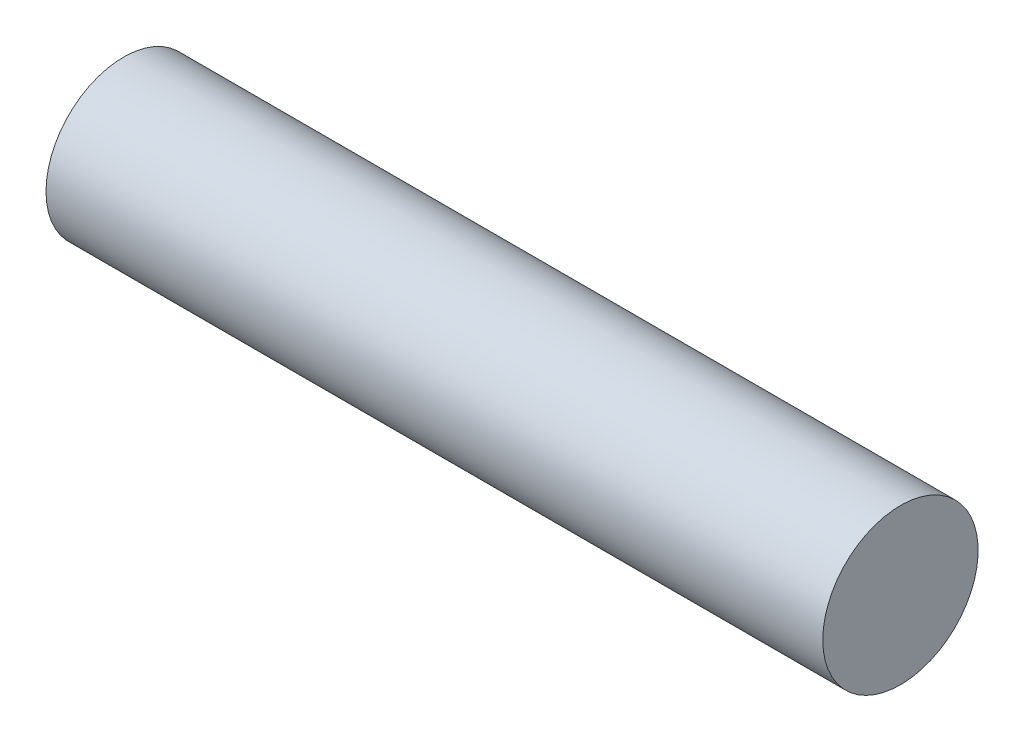
ISO-10303-21;
HEADER;
FILE_DESCRIPTION(('STEP AP214'),'2;1');
FILE_NAME('part.step','',(''),(''),'','','');
FILE_SCHEMA(('AUTOMOTIVE_DESIGN { 1 0 10303 214 1 1 1 1 }'));
ENDSEC;
DATA;
#1=APPLICATION_CONTEXT('core data for automotive mechanical design processes');
#2=APPLICATION_PROTOCOL_DEFINITION('international standard','automotive_design',2000,#1);
#3=PRODUCT_CONTEXT('',#1,'mechanical');
#4=PRODUCT('Part','Part','',(#3));
#5=PRODUCT_RELATED_PRODUCT_CATEGORY('part','',(#4));
#6=PRODUCT_DEFINITION_FORMATION('','',#4);
#7=PRODUCT_DEFINITION_CONTEXT('part definition',#1,'design');
#8=PRODUCT_DEFINITION('design','',#6,#7);
#9=PRODUCT_DEFINITION_SHAPE('','',#8);
#10=(LENGTH_UNIT() NAMED_UNIT(*) SI_UNIT(.MILLI.,.METRE.));
#11=(NAMED_UNIT(*) PLANE_ANGLE_UNIT() SI_UNIT($,.RADIAN.));
#12=(NAMED_UNIT(*) SI_UNIT($,.STERADIAN.) SOLID_ANGLE_UNIT());
#13=UNCERTAINTY_MEASURE_WITH_UNIT(LENGTH_MEASURE(1.E-05),#10,'distance_accuracy_value','');
#14=(GEOMETRIC_REPRESENTATION_CONTEXT(3) GLOBAL_UNCERTAINTY_ASSIGNED_CONTEXT((#13)) GLOBAL_UNIT_ASSIGNED_CONTEXT((#10,
#11,#12)) REPRESENTATION_CONTEXT('',''));
#15=CARTESIAN_POINT('',(0.,0.,0.));
#16=DIRECTION('',(0.,0.,1.));
#17=DIRECTION('',(1.,0.,0.));
#18=AXIS2_PLACEMENT_3D('',#15,#16,#17);
#19=CARTESIAN_POINT('',(4.99999999999989,0.5,0.));
#20=DIRECTION('',(-1.,0.,0.));
#21=DIRECTION('',(0.,0.,1.00000000000001));
#22=AXIS2_PLACEMENT_3D('',#19,#20,#21);
#23=PLANE('',#22);
#24=CARTESIAN_POINT('',(4.99999999999999,-0.5,0.));
#25=DIRECTION('',(-1.,0.,0.));
#26=DIRECTION('',(0.,0.,1.00000000000001));
#27=AXIS2_PLACEMENT_3D('',#24,#25,#26);
#28=CIRCLE('',#27,1.);
#29=CARTESIAN_POINT('',(4.99999999999999,-0.5,1.));
#30=VERTEX_POINT('',#29);
#31=EDGE_CURVE('E10',#30,#30,#28,.T.);
#32=ORIENTED_EDGE('',*,*,#31,.F.);
#33=EDGE_LOOP('',(#32));
#34=FACE_BOUND('',#33,.T.);
#35=ADVANCED_FACE('F32',(#34),#23,.F.);
#36=CARTESIAN_POINT('',(-5.,-0.500000000000257,0.));
#37=DIRECTION('',(-1.,0.,0.));
#38=DIRECTION('',(0.,0.,1.00000000000001));
#39=AXIS2_PLACEMENT_3D('',#36,#37,#38);
#40=CYLINDRICAL_SURFACE('',#39,1.);
#41=CARTESIAN_POINT('',(-5.,-0.500000000000257,0.));
#42=DIRECTION('',(-1.,0.,0.));
#43=DIRECTION('',(0.,0.,1.00000000000001));
#44=AXIS2_PLACEMENT_3D('',#41,#42,#43);
#45=CIRCLE('',#44,1.);
#46=CARTESIAN_POINT('',(-5.,-0.500000000000257,0.999999999999989));
#47=VERTEX_POINT('',#46);
#48=EDGE_CURVE('E38',#47,#47,#45,.T.);
#49=ORIENTED_EDGE('',*,*,#48,.F.);
#50=EDGE_LOOP('',(#49));
#51=FACE_BOUND('',#50,.T.);
#52=ORIENTED_EDGE('',*,*,#31,.T.);
#53=EDGE_LOOP('',(#52));
#54=FACE_BOUND('',#53,.T.);
#55=ADVANCED_FACE('F46',(#51,#54),#40,.T.);
#56=CARTESIAN_POINT('',(-5.00000000000016,0.499999999999799,0.));
#57=DIRECTION('',(1.,0.,0.));
#58=DIRECTION('',(0.,0.,-1.00000000000001));
#59=AXIS2_PLACEMENT_3D('',#56,#57,#58);
#60=PLANE('',#59);
#61=ORIENTED_EDGE('',*,*,#48,.T.);
#62=EDGE_LOOP('',(#61));
#63=FACE_BOUND('',#62,.T.);
#64=ADVANCED_FACE('F44',(#63),#60,.F.);
#65=CLOSED_SHELL('',(#35,#55,#64));
#66=MANIFOLD_SOLID_BREP('B2',#65);
#67=ADVANCED_BREP_SHAPE_REPRESENTATION('',(#18,#66),#14);
#68=SHAPE_DEFINITION_REPRESENTATION(#9,#67);
ENDSEC;
END-ISO-10303-21;
